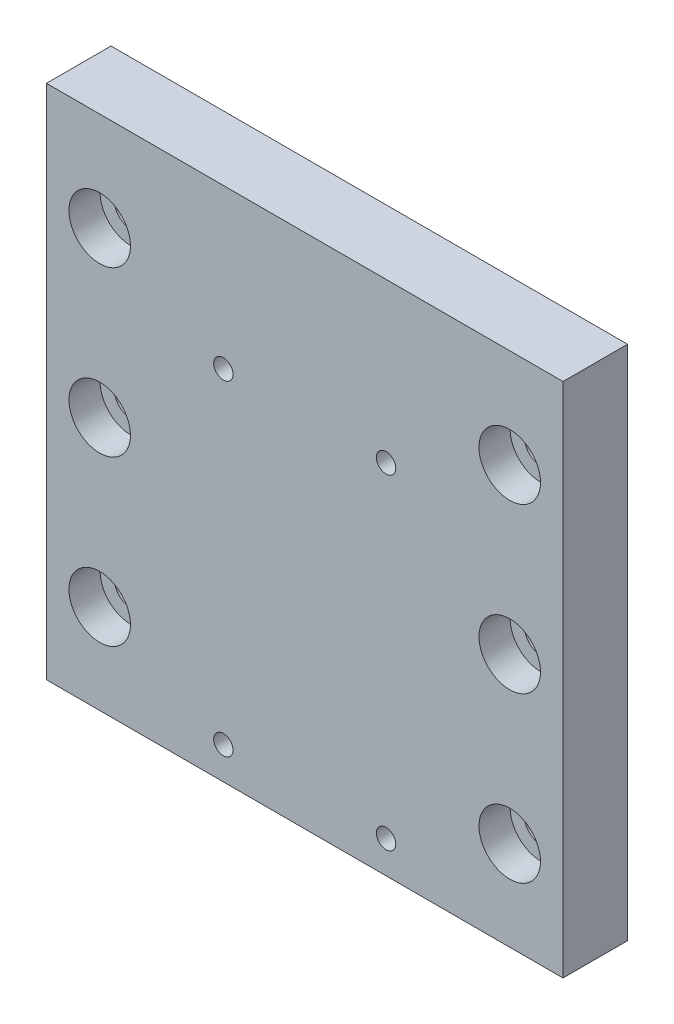
ISO-10303-21;
HEADER;
FILE_DESCRIPTION(('STEP AP214'),'2;1');
FILE_NAME('part.step','',(''),(''),'','','');
FILE_SCHEMA(('AUTOMOTIVE_DESIGN { 1 0 10303 214 1 1 1 1 }'));
ENDSEC;
DATA;
#1=APPLICATION_CONTEXT('core data for automotive mechanical design processes');
#2=APPLICATION_PROTOCOL_DEFINITION('international standard','automotive_design',2000,#1);
#3=PRODUCT_CONTEXT('',#1,'mechanical');
#4=PRODUCT('Part','Part','',(#3));
#5=PRODUCT_RELATED_PRODUCT_CATEGORY('part','',(#4));
#6=PRODUCT_DEFINITION_FORMATION('','',#4);
#7=PRODUCT_DEFINITION_CONTEXT('part definition',#1,'design');
#8=PRODUCT_DEFINITION('design','',#6,#7);
#9=PRODUCT_DEFINITION_SHAPE('','',#8);
#10=(LENGTH_UNIT() NAMED_UNIT(*) SI_UNIT(.MILLI.,.METRE.));
#11=(NAMED_UNIT(*) PLANE_ANGLE_UNIT() SI_UNIT($,.RADIAN.));
#12=(NAMED_UNIT(*) SI_UNIT($,.STERADIAN.) SOLID_ANGLE_UNIT());
#13=UNCERTAINTY_MEASURE_WITH_UNIT(LENGTH_MEASURE(1.E-05),#10,'distance_accuracy_value','');
#14=(GEOMETRIC_REPRESENTATION_CONTEXT(3) GLOBAL_UNCERTAINTY_ASSIGNED_CONTEXT((#13)) GLOBAL_UNIT_ASSIGNED_CONTEXT((#10,
#11,#12)) REPRESENTATION_CONTEXT('',''));
#15=CARTESIAN_POINT('',(0.,0.,0.));
#16=DIRECTION('',(0.,0.,1.));
#17=DIRECTION('',(1.,0.,0.));
#18=AXIS2_PLACEMENT_3D('',#15,#16,#17);
#19=CARTESIAN_POINT('',(-55.7364219114219,59.3850815850816,10.));
#20=DIRECTION('',(1.,0.,0.));
#21=DIRECTION('',(0.,1.,0.));
#22=AXIS2_PLACEMENT_3D('',#19,#20,#21);
#23=PLANE('',#22);
#24=DIRECTION('',(0.,-1.,0.));
#25=VECTOR('',#24,1.);
#26=CARTESIAN_POINT('',(-55.7364219114219,59.3850815850816,0.));
#27=LINE('',#26,#25);
#28=CARTESIAN_POINT('',(-55.7364219114219,59.3850815850816,0.));
#29=VERTEX_POINT('',#28);
#30=CARTESIAN_POINT('',(-55.7364219114219,-20.6149184149184,0.));
#31=VERTEX_POINT('',#30);
#32=EDGE_CURVE('E219',#29,#31,#27,.T.);
#33=ORIENTED_EDGE('',*,*,#32,.T.);
#34=DIRECTION('',(0.,0.,-1.));
#35=VECTOR('',#34,1.);
#36=CARTESIAN_POINT('',(-55.7364219114219,-20.6149184149184,10.));
#37=LINE('',#36,#35);
#38=CARTESIAN_POINT('',(-55.7364219114219,-20.6149184149184,10.));
#39=VERTEX_POINT('',#38);
#40=EDGE_CURVE('E11',#39,#31,#37,.T.);
#41=ORIENTED_EDGE('',*,*,#40,.F.);
#42=DIRECTION('',(0.,-1.,0.));
#43=VECTOR('',#42,1.);
#44=CARTESIAN_POINT('',(-55.7364219114219,59.3850815850816,10.));
#45=LINE('',#44,#43);
#46=CARTESIAN_POINT('',(-55.7364219114219,59.3850815850816,10.));
#47=VERTEX_POINT('',#46);
#48=EDGE_CURVE('E220',#47,#39,#45,.T.);
#49=ORIENTED_EDGE('',*,*,#48,.F.);
#50=DIRECTION('',(0.,0.,-1.));
#51=VECTOR('',#50,1.);
#52=CARTESIAN_POINT('',(-55.7364219114219,59.3850815850816,10.));
#53=LINE('',#52,#51);
#54=EDGE_CURVE('E226',#47,#29,#53,.T.);
#55=ORIENTED_EDGE('',*,*,#54,.T.);
#56=EDGE_LOOP('',(#33,#41,#49,#55));
#57=FACE_BOUND('',#56,.T.);
#58=ADVANCED_FACE('F31',(#57),#23,.F.);
#59=CARTESIAN_POINT('',(-55.7364219114219,-20.6149184149184,10.));
#60=DIRECTION('',(0.,1.,0.));
#61=DIRECTION('',(0.,0.,1.));
#62=AXIS2_PLACEMENT_3D('',#59,#60,#61);
#63=PLANE('',#62);
#64=DIRECTION('',(1.,0.,0.));
#65=VECTOR('',#64,1.);
#66=CARTESIAN_POINT('',(-55.7364219114219,-20.6149184149184,0.));
#67=LINE('',#66,#65);
#68=CARTESIAN_POINT('',(24.2635780885781,-20.6149184149184,0.));
#69=VERTEX_POINT('',#68);
#70=EDGE_CURVE('E229',#31,#69,#67,.T.);
#71=ORIENTED_EDGE('',*,*,#70,.T.);
#72=DIRECTION('',(0.,0.,-1.));
#73=VECTOR('',#72,1.);
#74=CARTESIAN_POINT('',(24.2635780885781,-20.6149184149184,10.));
#75=LINE('',#74,#73);
#76=CARTESIAN_POINT('',(24.2635780885781,-20.6149184149184,10.));
#77=VERTEX_POINT('',#76);
#78=EDGE_CURVE('E39',#77,#69,#75,.T.);
#79=ORIENTED_EDGE('',*,*,#78,.F.);
#80=DIRECTION('',(1.,0.,0.));
#81=VECTOR('',#80,1.);
#82=CARTESIAN_POINT('',(-55.7364219114219,-20.6149184149184,10.));
#83=LINE('',#82,#81);
#84=EDGE_CURVE('E78',#39,#77,#83,.T.);
#85=ORIENTED_EDGE('',*,*,#84,.F.);
#86=ORIENTED_EDGE('',*,*,#40,.T.);
#87=EDGE_LOOP('',(#71,#79,#85,#86));
#88=FACE_BOUND('',#87,.T.);
#89=ADVANCED_FACE('F253',(#88),#63,.F.);
#90=CARTESIAN_POINT('',(24.2635780885781,59.3850815850816,10.));
#91=DIRECTION('',(-1.,0.,0.));
#92=DIRECTION('',(0.,-1.,0.));
#93=AXIS2_PLACEMENT_3D('',#90,#91,#92);
#94=PLANE('',#93);
#95=DIRECTION('',(0.,1.,0.));
#96=VECTOR('',#95,1.);
#97=CARTESIAN_POINT('',(24.2635780885781,59.3850815850816,0.));
#98=LINE('',#97,#96);
#99=CARTESIAN_POINT('',(24.2635780885781,59.3850815850816,0.));
#100=VERTEX_POINT('',#99);
#101=EDGE_CURVE('E65',#69,#100,#98,.T.);
#102=ORIENTED_EDGE('',*,*,#101,.T.);
#103=DIRECTION('',(0.,0.,-1.));
#104=VECTOR('',#103,1.);
#105=CARTESIAN_POINT('',(24.2635780885781,59.3850815850816,10.));
#106=LINE('',#105,#104);
#107=CARTESIAN_POINT('',(24.2635780885781,59.3850815850816,10.));
#108=VERTEX_POINT('',#107);
#109=EDGE_CURVE('E234',#108,#100,#106,.T.);
#110=ORIENTED_EDGE('',*,*,#109,.F.);
#111=DIRECTION('',(0.,1.,0.));
#112=VECTOR('',#111,1.);
#113=CARTESIAN_POINT('',(24.2635780885781,59.3850815850816,10.));
#114=LINE('',#113,#112);
#115=EDGE_CURVE('E223',#77,#108,#114,.T.);
#116=ORIENTED_EDGE('',*,*,#115,.F.);
#117=ORIENTED_EDGE('',*,*,#78,.T.);
#118=EDGE_LOOP('',(#102,#110,#116,#117));
#119=FACE_BOUND('',#118,.T.);
#120=ADVANCED_FACE('F236',(#119),#94,.F.);
#121=CARTESIAN_POINT('',(-55.7364219114219,59.3850815850816,10.));
#122=DIRECTION('',(0.,-1.,0.));
#123=DIRECTION('',(0.,0.,-1.));
#124=AXIS2_PLACEMENT_3D('',#121,#122,#123);
#125=PLANE('',#124);
#126=DIRECTION('',(-1.,0.,0.));
#127=VECTOR('',#126,1.);
#128=CARTESIAN_POINT('',(-55.7364219114219,59.3850815850816,0.));
#129=LINE('',#128,#127);
#130=EDGE_CURVE('E71',#100,#29,#129,.T.);
#131=ORIENTED_EDGE('',*,*,#130,.T.);
#132=ORIENTED_EDGE('',*,*,#54,.F.);
#133=DIRECTION('',(-1.,0.,0.));
#134=VECTOR('',#133,1.);
#135=CARTESIAN_POINT('',(-55.7364219114219,59.3850815850816,10.));
#136=LINE('',#135,#134);
#137=EDGE_CURVE('E47',#108,#47,#136,.T.);
#138=ORIENTED_EDGE('',*,*,#137,.F.);
#139=ORIENTED_EDGE('',*,*,#109,.T.);
#140=EDGE_LOOP('',(#131,#132,#138,#139));
#141=FACE_BOUND('',#140,.T.);
#142=ADVANCED_FACE('F243',(#141),#125,.F.);
#143=CARTESIAN_POINT('',(-55.7364219114219,-20.6149184149184,10.));
#144=DIRECTION('',(0.,0.,1.));
#145=DIRECTION('',(1.,0.,0.));
#146=AXIS2_PLACEMENT_3D('',#143,#144,#145);
#147=PLANE('',#146);
#148=CARTESIAN_POINT('',(-3.13642191142191,34.7850815850816,10.));
#149=DIRECTION('',(0.,0.,1.));
#150=DIRECTION('',(1.,0.,0.));
#151=AXIS2_PLACEMENT_3D('',#148,#149,#150);
#152=CIRCLE('',#151,1.5);
#153=CARTESIAN_POINT('',(-1.63642191142191,34.7850815850816,10.));
#154=VERTEX_POINT('',#153);
#155=EDGE_CURVE('E108',#154,#154,#152,.T.);
#156=ORIENTED_EDGE('',*,*,#155,.F.);
#157=EDGE_LOOP('',(#156));
#158=FACE_BOUND('',#157,.T.);
#159=CARTESIAN_POINT('',(-3.13642191142191,-15.6149184149184,10.));
#160=DIRECTION('',(0.,0.,1.));
#161=DIRECTION('',(1.,0.,0.));
#162=AXIS2_PLACEMENT_3D('',#159,#160,#161);
#163=CIRCLE('',#162,1.5);
#164=CARTESIAN_POINT('',(-1.63642191142191,-15.6149184149184,10.));
#165=VERTEX_POINT('',#164);
#166=EDGE_CURVE('E120',#165,#165,#163,.T.);
#167=ORIENTED_EDGE('',*,*,#166,.F.);
#168=EDGE_LOOP('',(#167));
#169=FACE_BOUND('',#168,.T.);
#170=CARTESIAN_POINT('',(-28.3364219114219,34.7850815850816,10.));
#171=DIRECTION('',(0.,0.,1.));
#172=DIRECTION('',(1.,0.,0.));
#173=AXIS2_PLACEMENT_3D('',#170,#171,#172);
#174=CIRCLE('',#173,1.5);
#175=CARTESIAN_POINT('',(-26.8364219114219,34.7850815850816,10.));
#176=VERTEX_POINT('',#175);
#177=EDGE_CURVE('E132',#176,#176,#174,.T.);
#178=ORIENTED_EDGE('',*,*,#177,.F.);
#179=EDGE_LOOP('',(#178));
#180=FACE_BOUND('',#179,.T.);
#181=CARTESIAN_POINT('',(-28.3364219114219,-15.6149184149184,10.));
#182=DIRECTION('',(0.,0.,1.));
#183=DIRECTION('',(1.,0.,0.));
#184=AXIS2_PLACEMENT_3D('',#181,#182,#183);
#185=CIRCLE('',#184,1.5);
#186=CARTESIAN_POINT('',(-26.8364219114219,-15.6149184149184,10.));
#187=VERTEX_POINT('',#186);
#188=EDGE_CURVE('E144',#187,#187,#185,.T.);
#189=ORIENTED_EDGE('',*,*,#188,.F.);
#190=EDGE_LOOP('',(#189));
#191=FACE_BOUND('',#190,.T.);
#192=CARTESIAN_POINT('',(-47.4864219114219,44.0778554778555,10.));
#193=DIRECTION('',(0.,0.,1.));
#194=DIRECTION('',(1.,0.,0.));
#195=AXIS2_PLACEMENT_3D('',#192,#193,#194);
#196=CIRCLE('',#195,4.76249999999999);
#197=CARTESIAN_POINT('',(-42.7239219114219,44.0778554778555,10.));
#198=VERTEX_POINT('',#197);
#199=EDGE_CURVE('E156',#198,#198,#196,.T.);
#200=ORIENTED_EDGE('',*,*,#199,.F.);
#201=EDGE_LOOP('',(#200));
#202=FACE_BOUND('',#201,.T.);
#203=CARTESIAN_POINT('',(-47.4864219114219,18.6778554778555,10.));
#204=DIRECTION('',(0.,0.,1.));
#205=DIRECTION('',(1.,0.,0.));
#206=AXIS2_PLACEMENT_3D('',#203,#204,#205);
#207=CIRCLE('',#206,4.76249999999999);
#208=CARTESIAN_POINT('',(-42.7239219114219,18.6778554778555,10.));
#209=VERTEX_POINT('',#208);
#210=EDGE_CURVE('E168',#209,#209,#207,.T.);
#211=ORIENTED_EDGE('',*,*,#210,.F.);
#212=EDGE_LOOP('',(#211));
#213=FACE_BOUND('',#212,.T.);
#214=CARTESIAN_POINT('',(-47.4864219114219,-6.7221445221445,10.));
#215=DIRECTION('',(0.,0.,1.));
#216=DIRECTION('',(1.,0.,0.));
#217=AXIS2_PLACEMENT_3D('',#214,#215,#216);
#218=CIRCLE('',#217,4.76249999999999);
#219=CARTESIAN_POINT('',(-42.7239219114219,-6.7221445221445,10.));
#220=VERTEX_POINT('',#219);
#221=EDGE_CURVE('E180',#220,#220,#218,.T.);
#222=ORIENTED_EDGE('',*,*,#221,.F.);
#223=EDGE_LOOP('',(#222));
#224=FACE_BOUND('',#223,.T.);
#225=CARTESIAN_POINT('',(16.0135780885781,-6.7221445221445,10.));
#226=DIRECTION('',(0.,0.,1.));
#227=DIRECTION('',(1.,0.,0.));
#228=AXIS2_PLACEMENT_3D('',#225,#226,#227);
#229=CIRCLE('',#228,4.76249999999999);
#230=CARTESIAN_POINT('',(20.7760780885781,-6.7221445221445,10.));
#231=VERTEX_POINT('',#230);
#232=EDGE_CURVE('E192',#231,#231,#229,.T.);
#233=ORIENTED_EDGE('',*,*,#232,.F.);
#234=EDGE_LOOP('',(#233));
#235=FACE_BOUND('',#234,.T.);
#236=CARTESIAN_POINT('',(16.0135780885781,18.6778554778555,10.));
#237=DIRECTION('',(0.,0.,1.));
#238=DIRECTION('',(1.,0.,0.));
#239=AXIS2_PLACEMENT_3D('',#236,#237,#238);
#240=CIRCLE('',#239,4.76249999999999);
#241=CARTESIAN_POINT('',(20.7760780885781,18.6778554778555,10.));
#242=VERTEX_POINT('',#241);
#243=EDGE_CURVE('E204',#242,#242,#240,.T.);
#244=ORIENTED_EDGE('',*,*,#243,.F.);
#245=EDGE_LOOP('',(#244));
#246=FACE_BOUND('',#245,.T.);
#247=CARTESIAN_POINT('',(16.0135780885781,44.0778554778555,10.));
#248=DIRECTION('',(0.,0.,1.));
#249=DIRECTION('',(1.,0.,0.));
#250=AXIS2_PLACEMENT_3D('',#247,#248,#249);
#251=CIRCLE('',#250,4.76249999999999);
#252=CARTESIAN_POINT('',(20.7760780885781,44.0778554778555,10.));
#253=VERTEX_POINT('',#252);
#254=EDGE_CURVE('E216',#253,#253,#251,.T.);
#255=ORIENTED_EDGE('',*,*,#254,.F.);
#256=EDGE_LOOP('',(#255));
#257=FACE_BOUND('',#256,.T.);
#258=ORIENTED_EDGE('',*,*,#48,.T.);
#259=ORIENTED_EDGE('',*,*,#84,.T.);
#260=ORIENTED_EDGE('',*,*,#115,.T.);
#261=ORIENTED_EDGE('',*,*,#137,.T.);
#262=EDGE_LOOP('',(#258,#259,#260,#261));
#263=FACE_BOUND('',#262,.T.);
#264=ADVANCED_FACE('F245',(#158,#169,#180,#191,#202,#213,#224,#235,#246,#257,#263),#147,.T.);
#265=CARTESIAN_POINT('',(-55.7364219114219,-20.6149184149184,0.));
#266=DIRECTION('',(0.,0.,1.));
#267=DIRECTION('',(1.,0.,0.));
#268=AXIS2_PLACEMENT_3D('',#265,#266,#267);
#269=PLANE('',#268);
#270=CARTESIAN_POINT('',(-47.4864219114219,44.0778554778555,0.));
#271=DIRECTION('',(0.,0.,1.));
#272=DIRECTION('',(1.,0.,0.));
#273=AXIS2_PLACEMENT_3D('',#270,#271,#272);
#274=CIRCLE('',#273,2.5527);
#275=CARTESIAN_POINT('',(-44.9337219114219,44.0778554778555,0.));
#276=VERTEX_POINT('',#275);
#277=EDGE_CURVE('E147',#276,#276,#274,.T.);
#278=ORIENTED_EDGE('',*,*,#277,.T.);
#279=EDGE_LOOP('',(#278));
#280=FACE_BOUND('',#279,.T.);
#281=CARTESIAN_POINT('',(-47.4864219114219,18.6778554778555,0.));
#282=DIRECTION('',(0.,0.,1.));
#283=DIRECTION('',(1.,0.,0.));
#284=AXIS2_PLACEMENT_3D('',#281,#282,#283);
#285=CIRCLE('',#284,2.5527);
#286=CARTESIAN_POINT('',(-44.9337219114219,18.6778554778555,0.));
#287=VERTEX_POINT('',#286);
#288=EDGE_CURVE('E159',#287,#287,#285,.T.);
#289=ORIENTED_EDGE('',*,*,#288,.T.);
#290=EDGE_LOOP('',(#289));
#291=FACE_BOUND('',#290,.T.);
#292=CARTESIAN_POINT('',(-47.4864219114219,-6.7221445221445,0.));
#293=DIRECTION('',(0.,0.,1.));
#294=DIRECTION('',(1.,0.,0.));
#295=AXIS2_PLACEMENT_3D('',#292,#293,#294);
#296=CIRCLE('',#295,2.5527);
#297=CARTESIAN_POINT('',(-44.9337219114219,-6.7221445221445,0.));
#298=VERTEX_POINT('',#297);
#299=EDGE_CURVE('E171',#298,#298,#296,.T.);
#300=ORIENTED_EDGE('',*,*,#299,.T.);
#301=EDGE_LOOP('',(#300));
#302=FACE_BOUND('',#301,.T.);
#303=CARTESIAN_POINT('',(16.0135780885781,-6.7221445221445,0.));
#304=DIRECTION('',(0.,0.,1.));
#305=DIRECTION('',(1.,0.,0.));
#306=AXIS2_PLACEMENT_3D('',#303,#304,#305);
#307=CIRCLE('',#306,2.5527);
#308=CARTESIAN_POINT('',(18.5662780885781,-6.7221445221445,0.));
#309=VERTEX_POINT('',#308);
#310=EDGE_CURVE('E183',#309,#309,#307,.T.);
#311=ORIENTED_EDGE('',*,*,#310,.T.);
#312=EDGE_LOOP('',(#311));
#313=FACE_BOUND('',#312,.T.);
#314=CARTESIAN_POINT('',(16.0135780885781,18.6778554778555,0.));
#315=DIRECTION('',(0.,0.,1.));
#316=DIRECTION('',(1.,0.,0.));
#317=AXIS2_PLACEMENT_3D('',#314,#315,#316);
#318=CIRCLE('',#317,2.5527);
#319=CARTESIAN_POINT('',(18.5662780885781,18.6778554778555,0.));
#320=VERTEX_POINT('',#319);
#321=EDGE_CURVE('E195',#320,#320,#318,.T.);
#322=ORIENTED_EDGE('',*,*,#321,.T.);
#323=EDGE_LOOP('',(#322));
#324=FACE_BOUND('',#323,.T.);
#325=CARTESIAN_POINT('',(16.0135780885781,44.0778554778555,0.));
#326=DIRECTION('',(0.,0.,1.));
#327=DIRECTION('',(1.,0.,0.));
#328=AXIS2_PLACEMENT_3D('',#325,#326,#327);
#329=CIRCLE('',#328,2.5527);
#330=CARTESIAN_POINT('',(18.5662780885781,44.0778554778555,0.));
#331=VERTEX_POINT('',#330);
#332=EDGE_CURVE('E207',#331,#331,#329,.T.);
#333=ORIENTED_EDGE('',*,*,#332,.T.);
#334=EDGE_LOOP('',(#333));
#335=FACE_BOUND('',#334,.T.);
#336=ORIENTED_EDGE('',*,*,#32,.F.);
#337=ORIENTED_EDGE('',*,*,#130,.F.);
#338=ORIENTED_EDGE('',*,*,#101,.F.);
#339=ORIENTED_EDGE('',*,*,#70,.F.);
#340=EDGE_LOOP('',(#336,#337,#338,#339));
#341=FACE_BOUND('',#340,.T.);
#342=ADVANCED_FACE('F239',(#280,#291,#302,#313,#324,#335,#341),#269,.F.);
#343=CARTESIAN_POINT('',(16.0135780885781,44.0778554778555,10.));
#344=DIRECTION('',(0.,0.,1.));
#345=DIRECTION('',(1.,0.,0.));
#346=AXIS2_PLACEMENT_3D('',#343,#344,#345);
#347=CYLINDRICAL_SURFACE('',#346,4.76249999999999);
#348=CARTESIAN_POINT('',(16.0135780885781,44.0778554778555,5.174));
#349=DIRECTION('',(0.,0.,1.));
#350=DIRECTION('',(1.,0.,0.));
#351=AXIS2_PLACEMENT_3D('',#348,#349,#350);
#352=CIRCLE('',#351,4.76249999999999);
#353=CARTESIAN_POINT('',(20.7760780885781,44.0778554778555,5.174));
#354=VERTEX_POINT('',#353);
#355=EDGE_CURVE('E213',#354,#354,#352,.T.);
#356=ORIENTED_EDGE('',*,*,#355,.F.);
#357=EDGE_LOOP('',(#356));
#358=FACE_BOUND('',#357,.T.);
#359=ORIENTED_EDGE('',*,*,#254,.T.);
#360=EDGE_LOOP('',(#359));
#361=FACE_BOUND('',#360,.T.);
#362=ADVANCED_FACE('F280',(#358,#361),#347,.F.);
#363=CARTESIAN_POINT('',(18.5662780885781,44.0778554778555,5.174));
#364=DIRECTION('',(0.,0.,-1.));
#365=DIRECTION('',(-1.,0.,0.));
#366=AXIS2_PLACEMENT_3D('',#363,#364,#365);
#367=PLANE('',#366);
#368=CARTESIAN_POINT('',(16.0135780885781,44.0778554778555,5.174));
#369=DIRECTION('',(0.,0.,1.));
#370=DIRECTION('',(1.,0.,0.));
#371=AXIS2_PLACEMENT_3D('',#368,#369,#370);
#372=CIRCLE('',#371,2.55270000000001);
#373=CARTESIAN_POINT('',(18.5662780885781,44.0778554778555,5.174));
#374=VERTEX_POINT('',#373);
#375=EDGE_CURVE('E210',#374,#374,#372,.T.);
#376=ORIENTED_EDGE('',*,*,#375,.F.);
#377=EDGE_LOOP('',(#376));
#378=FACE_BOUND('',#377,.T.);
#379=ORIENTED_EDGE('',*,*,#355,.T.);
#380=EDGE_LOOP('',(#379));
#381=FACE_BOUND('',#380,.T.);
#382=ADVANCED_FACE('F289',(#378,#381),#367,.F.);
#383=CARTESIAN_POINT('',(16.0135780885781,44.0778554778555,10.));
#384=DIRECTION('',(0.,0.,1.));
#385=DIRECTION('',(1.,0.,0.));
#386=AXIS2_PLACEMENT_3D('',#383,#384,#385);
#387=CYLINDRICAL_SURFACE('',#386,2.55270000000001);
#388=ORIENTED_EDGE('',*,*,#332,.F.);
#389=EDGE_LOOP('',(#388));
#390=FACE_BOUND('',#389,.T.);
#391=ORIENTED_EDGE('',*,*,#375,.T.);
#392=EDGE_LOOP('',(#391));
#393=FACE_BOUND('',#392,.T.);
#394=ADVANCED_FACE('F299',(#390,#393),#387,.F.);
#395=CARTESIAN_POINT('',(16.0135780885781,18.6778554778555,10.));
#396=DIRECTION('',(0.,0.,1.));
#397=DIRECTION('',(1.,0.,0.));
#398=AXIS2_PLACEMENT_3D('',#395,#396,#397);
#399=CYLINDRICAL_SURFACE('',#398,4.76249999999999);
#400=CARTESIAN_POINT('',(16.0135780885781,18.6778554778555,5.174));
#401=DIRECTION('',(0.,0.,1.));
#402=DIRECTION('',(1.,0.,0.));
#403=AXIS2_PLACEMENT_3D('',#400,#401,#402);
#404=CIRCLE('',#403,4.76249999999999);
#405=CARTESIAN_POINT('',(20.7760780885781,18.6778554778555,5.174));
#406=VERTEX_POINT('',#405);
#407=EDGE_CURVE('E201',#406,#406,#404,.T.);
#408=ORIENTED_EDGE('',*,*,#407,.F.);
#409=EDGE_LOOP('',(#408));
#410=FACE_BOUND('',#409,.T.);
#411=ORIENTED_EDGE('',*,*,#243,.T.);
#412=EDGE_LOOP('',(#411));
#413=FACE_BOUND('',#412,.T.);
#414=ADVANCED_FACE('F309',(#410,#413),#399,.F.);
#415=CARTESIAN_POINT('',(18.5662780885781,18.6778554778555,5.174));
#416=DIRECTION('',(0.,0.,-1.));
#417=DIRECTION('',(-1.,0.,0.));
#418=AXIS2_PLACEMENT_3D('',#415,#416,#417);
#419=PLANE('',#418);
#420=CARTESIAN_POINT('',(16.0135780885781,18.6778554778555,5.174));
#421=DIRECTION('',(0.,0.,1.));
#422=DIRECTION('',(1.,0.,0.));
#423=AXIS2_PLACEMENT_3D('',#420,#421,#422);
#424=CIRCLE('',#423,2.55270000000001);
#425=CARTESIAN_POINT('',(18.5662780885781,18.6778554778555,5.174));
#426=VERTEX_POINT('',#425);
#427=EDGE_CURVE('E198',#426,#426,#424,.T.);
#428=ORIENTED_EDGE('',*,*,#427,.F.);
#429=EDGE_LOOP('',(#428));
#430=FACE_BOUND('',#429,.T.);
#431=ORIENTED_EDGE('',*,*,#407,.T.);
#432=EDGE_LOOP('',(#431));
#433=FACE_BOUND('',#432,.T.);
#434=ADVANCED_FACE('F319',(#430,#433),#419,.F.);
#435=CARTESIAN_POINT('',(16.0135780885781,18.6778554778555,10.));
#436=DIRECTION('',(0.,0.,1.));
#437=DIRECTION('',(1.,0.,0.));
#438=AXIS2_PLACEMENT_3D('',#435,#436,#437);
#439=CYLINDRICAL_SURFACE('',#438,2.55270000000001);
#440=ORIENTED_EDGE('',*,*,#321,.F.);
#441=EDGE_LOOP('',(#440));
#442=FACE_BOUND('',#441,.T.);
#443=ORIENTED_EDGE('',*,*,#427,.T.);
#444=EDGE_LOOP('',(#443));
#445=FACE_BOUND('',#444,.T.);
#446=ADVANCED_FACE('F329',(#442,#445),#439,.F.);
#447=CARTESIAN_POINT('',(16.0135780885781,-6.7221445221445,10.));
#448=DIRECTION('',(0.,0.,1.));
#449=DIRECTION('',(1.,0.,0.));
#450=AXIS2_PLACEMENT_3D('',#447,#448,#449);
#451=CYLINDRICAL_SURFACE('',#450,4.76249999999999);
#452=CARTESIAN_POINT('',(16.0135780885781,-6.7221445221445,5.174));
#453=DIRECTION('',(0.,0.,1.));
#454=DIRECTION('',(1.,0.,0.));
#455=AXIS2_PLACEMENT_3D('',#452,#453,#454);
#456=CIRCLE('',#455,4.76249999999999);
#457=CARTESIAN_POINT('',(20.7760780885781,-6.7221445221445,5.174));
#458=VERTEX_POINT('',#457);
#459=EDGE_CURVE('E189',#458,#458,#456,.T.);
#460=ORIENTED_EDGE('',*,*,#459,.F.);
#461=EDGE_LOOP('',(#460));
#462=FACE_BOUND('',#461,.T.);
#463=ORIENTED_EDGE('',*,*,#232,.T.);
#464=EDGE_LOOP('',(#463));
#465=FACE_BOUND('',#464,.T.);
#466=ADVANCED_FACE('F339',(#462,#465),#451,.F.);
#467=CARTESIAN_POINT('',(18.5662780885781,-6.7221445221445,5.174));
#468=DIRECTION('',(0.,0.,-1.));
#469=DIRECTION('',(-1.,0.,0.));
#470=AXIS2_PLACEMENT_3D('',#467,#468,#469);
#471=PLANE('',#470);
#472=CARTESIAN_POINT('',(16.0135780885781,-6.7221445221445,5.174));
#473=DIRECTION('',(0.,0.,1.));
#474=DIRECTION('',(1.,0.,0.));
#475=AXIS2_PLACEMENT_3D('',#472,#473,#474);
#476=CIRCLE('',#475,2.55270000000001);
#477=CARTESIAN_POINT('',(18.5662780885781,-6.7221445221445,5.174));
#478=VERTEX_POINT('',#477);
#479=EDGE_CURVE('E186',#478,#478,#476,.T.);
#480=ORIENTED_EDGE('',*,*,#479,.F.);
#481=EDGE_LOOP('',(#480));
#482=FACE_BOUND('',#481,.T.);
#483=ORIENTED_EDGE('',*,*,#459,.T.);
#484=EDGE_LOOP('',(#483));
#485=FACE_BOUND('',#484,.T.);
#486=ADVANCED_FACE('F349',(#482,#485),#471,.F.);
#487=CARTESIAN_POINT('',(16.0135780885781,-6.7221445221445,10.));
#488=DIRECTION('',(0.,0.,1.));
#489=DIRECTION('',(1.,0.,0.));
#490=AXIS2_PLACEMENT_3D('',#487,#488,#489);
#491=CYLINDRICAL_SURFACE('',#490,2.55270000000001);
#492=ORIENTED_EDGE('',*,*,#310,.F.);
#493=EDGE_LOOP('',(#492));
#494=FACE_BOUND('',#493,.T.);
#495=ORIENTED_EDGE('',*,*,#479,.T.);
#496=EDGE_LOOP('',(#495));
#497=FACE_BOUND('',#496,.T.);
#498=ADVANCED_FACE('F359',(#494,#497),#491,.F.);
#499=CARTESIAN_POINT('',(-47.4864219114219,-6.7221445221445,10.));
#500=DIRECTION('',(0.,0.,1.));
#501=DIRECTION('',(1.,0.,0.));
#502=AXIS2_PLACEMENT_3D('',#499,#500,#501);
#503=CYLINDRICAL_SURFACE('',#502,4.76249999999999);
#504=CARTESIAN_POINT('',(-47.4864219114219,-6.7221445221445,5.174));
#505=DIRECTION('',(0.,0.,1.));
#506=DIRECTION('',(1.,0.,0.));
#507=AXIS2_PLACEMENT_3D('',#504,#505,#506);
#508=CIRCLE('',#507,4.76249999999999);
#509=CARTESIAN_POINT('',(-42.7239219114219,-6.7221445221445,5.174));
#510=VERTEX_POINT('',#509);
#511=EDGE_CURVE('E177',#510,#510,#508,.T.);
#512=ORIENTED_EDGE('',*,*,#511,.F.);
#513=EDGE_LOOP('',(#512));
#514=FACE_BOUND('',#513,.T.);
#515=ORIENTED_EDGE('',*,*,#221,.T.);
#516=EDGE_LOOP('',(#515));
#517=FACE_BOUND('',#516,.T.);
#518=ADVANCED_FACE('F369',(#514,#517),#503,.F.);
#519=CARTESIAN_POINT('',(-44.9337219114219,-6.7221445221445,5.174));
#520=DIRECTION('',(0.,0.,-1.));
#521=DIRECTION('',(-1.,0.,0.));
#522=AXIS2_PLACEMENT_3D('',#519,#520,#521);
#523=PLANE('',#522);
#524=CARTESIAN_POINT('',(-47.4864219114219,-6.7221445221445,5.174));
#525=DIRECTION('',(0.,0.,1.));
#526=DIRECTION('',(1.,0.,0.));
#527=AXIS2_PLACEMENT_3D('',#524,#525,#526);
#528=CIRCLE('',#527,2.55270000000001);
#529=CARTESIAN_POINT('',(-44.9337219114219,-6.7221445221445,5.174));
#530=VERTEX_POINT('',#529);
#531=EDGE_CURVE('E174',#530,#530,#528,.T.);
#532=ORIENTED_EDGE('',*,*,#531,.F.);
#533=EDGE_LOOP('',(#532));
#534=FACE_BOUND('',#533,.T.);
#535=ORIENTED_EDGE('',*,*,#511,.T.);
#536=EDGE_LOOP('',(#535));
#537=FACE_BOUND('',#536,.T.);
#538=ADVANCED_FACE('F379',(#534,#537),#523,.F.);
#539=CARTESIAN_POINT('',(-47.4864219114219,-6.7221445221445,10.));
#540=DIRECTION('',(0.,0.,1.));
#541=DIRECTION('',(1.,0.,0.));
#542=AXIS2_PLACEMENT_3D('',#539,#540,#541);
#543=CYLINDRICAL_SURFACE('',#542,2.55270000000001);
#544=ORIENTED_EDGE('',*,*,#299,.F.);
#545=EDGE_LOOP('',(#544));
#546=FACE_BOUND('',#545,.T.);
#547=ORIENTED_EDGE('',*,*,#531,.T.);
#548=EDGE_LOOP('',(#547));
#549=FACE_BOUND('',#548,.T.);
#550=ADVANCED_FACE('F389',(#546,#549),#543,.F.);
#551=CARTESIAN_POINT('',(-47.4864219114219,18.6778554778555,10.));
#552=DIRECTION('',(0.,0.,1.));
#553=DIRECTION('',(1.,0.,0.));
#554=AXIS2_PLACEMENT_3D('',#551,#552,#553);
#555=CYLINDRICAL_SURFACE('',#554,4.76249999999999);
#556=CARTESIAN_POINT('',(-47.4864219114219,18.6778554778555,5.174));
#557=DIRECTION('',(0.,0.,1.));
#558=DIRECTION('',(1.,0.,0.));
#559=AXIS2_PLACEMENT_3D('',#556,#557,#558);
#560=CIRCLE('',#559,4.76249999999999);
#561=CARTESIAN_POINT('',(-42.7239219114219,18.6778554778555,5.174));
#562=VERTEX_POINT('',#561);
#563=EDGE_CURVE('E165',#562,#562,#560,.T.);
#564=ORIENTED_EDGE('',*,*,#563,.F.);
#565=EDGE_LOOP('',(#564));
#566=FACE_BOUND('',#565,.T.);
#567=ORIENTED_EDGE('',*,*,#210,.T.);
#568=EDGE_LOOP('',(#567));
#569=FACE_BOUND('',#568,.T.);
#570=ADVANCED_FACE('F399',(#566,#569),#555,.F.);
#571=CARTESIAN_POINT('',(-44.9337219114219,18.6778554778555,5.174));
#572=DIRECTION('',(0.,0.,-1.));
#573=DIRECTION('',(-1.,0.,0.));
#574=AXIS2_PLACEMENT_3D('',#571,#572,#573);
#575=PLANE('',#574);
#576=CARTESIAN_POINT('',(-47.4864219114219,18.6778554778555,5.174));
#577=DIRECTION('',(0.,0.,1.));
#578=DIRECTION('',(1.,0.,0.));
#579=AXIS2_PLACEMENT_3D('',#576,#577,#578);
#580=CIRCLE('',#579,2.55270000000001);
#581=CARTESIAN_POINT('',(-44.9337219114219,18.6778554778555,5.174));
#582=VERTEX_POINT('',#581);
#583=EDGE_CURVE('E162',#582,#582,#580,.T.);
#584=ORIENTED_EDGE('',*,*,#583,.F.);
#585=EDGE_LOOP('',(#584));
#586=FACE_BOUND('',#585,.T.);
#587=ORIENTED_EDGE('',*,*,#563,.T.);
#588=EDGE_LOOP('',(#587));
#589=FACE_BOUND('',#588,.T.);
#590=ADVANCED_FACE('F409',(#586,#589),#575,.F.);
#591=CARTESIAN_POINT('',(-47.4864219114219,18.6778554778555,10.));
#592=DIRECTION('',(0.,0.,1.));
#593=DIRECTION('',(1.,0.,0.));
#594=AXIS2_PLACEMENT_3D('',#591,#592,#593);
#595=CYLINDRICAL_SURFACE('',#594,2.55270000000001);
#596=ORIENTED_EDGE('',*,*,#288,.F.);
#597=EDGE_LOOP('',(#596));
#598=FACE_BOUND('',#597,.T.);
#599=ORIENTED_EDGE('',*,*,#583,.T.);
#600=EDGE_LOOP('',(#599));
#601=FACE_BOUND('',#600,.T.);
#602=ADVANCED_FACE('F419',(#598,#601),#595,.F.);
#603=CARTESIAN_POINT('',(-47.4864219114219,44.0778554778555,10.));
#604=DIRECTION('',(0.,0.,1.));
#605=DIRECTION('',(1.,0.,0.));
#606=AXIS2_PLACEMENT_3D('',#603,#604,#605);
#607=CYLINDRICAL_SURFACE('',#606,4.76249999999999);
#608=CARTESIAN_POINT('',(-47.4864219114219,44.0778554778555,5.174));
#609=DIRECTION('',(0.,0.,1.));
#610=DIRECTION('',(1.,0.,0.));
#611=AXIS2_PLACEMENT_3D('',#608,#609,#610);
#612=CIRCLE('',#611,4.76249999999999);
#613=CARTESIAN_POINT('',(-42.7239219114219,44.0778554778555,5.174));
#614=VERTEX_POINT('',#613);
#615=EDGE_CURVE('E153',#614,#614,#612,.T.);
#616=ORIENTED_EDGE('',*,*,#615,.F.);
#617=EDGE_LOOP('',(#616));
#618=FACE_BOUND('',#617,.T.);
#619=ORIENTED_EDGE('',*,*,#199,.T.);
#620=EDGE_LOOP('',(#619));
#621=FACE_BOUND('',#620,.T.);
#622=ADVANCED_FACE('F429',(#618,#621),#607,.F.);
#623=CARTESIAN_POINT('',(-44.9337219114219,44.0778554778555,5.174));
#624=DIRECTION('',(0.,0.,-1.));
#625=DIRECTION('',(-1.,0.,0.));
#626=AXIS2_PLACEMENT_3D('',#623,#624,#625);
#627=PLANE('',#626);
#628=CARTESIAN_POINT('',(-47.4864219114219,44.0778554778555,5.174));
#629=DIRECTION('',(0.,0.,1.));
#630=DIRECTION('',(1.,0.,0.));
#631=AXIS2_PLACEMENT_3D('',#628,#629,#630);
#632=CIRCLE('',#631,2.55270000000001);
#633=CARTESIAN_POINT('',(-44.9337219114219,44.0778554778555,5.174));
#634=VERTEX_POINT('',#633);
#635=EDGE_CURVE('E150',#634,#634,#632,.T.);
#636=ORIENTED_EDGE('',*,*,#635,.F.);
#637=EDGE_LOOP('',(#636));
#638=FACE_BOUND('',#637,.T.);
#639=ORIENTED_EDGE('',*,*,#615,.T.);
#640=EDGE_LOOP('',(#639));
#641=FACE_BOUND('',#640,.T.);
#642=ADVANCED_FACE('F439',(#638,#641),#627,.F.);
#643=CARTESIAN_POINT('',(-47.4864219114219,44.0778554778555,10.));
#644=DIRECTION('',(0.,0.,1.));
#645=DIRECTION('',(1.,0.,0.));
#646=AXIS2_PLACEMENT_3D('',#643,#644,#645);
#647=CYLINDRICAL_SURFACE('',#646,2.55270000000001);
#648=ORIENTED_EDGE('',*,*,#277,.F.);
#649=EDGE_LOOP('',(#648));
#650=FACE_BOUND('',#649,.T.);
#651=ORIENTED_EDGE('',*,*,#635,.T.);
#652=EDGE_LOOP('',(#651));
#653=FACE_BOUND('',#652,.T.);
#654=ADVANCED_FACE('F449',(#650,#653),#647,.F.);
#655=CARTESIAN_POINT('',(-28.3364219114219,-15.6149184149184,10.));
#656=DIRECTION('',(0.,0.,1.));
#657=DIRECTION('',(1.,0.,0.));
#658=AXIS2_PLACEMENT_3D('',#655,#656,#657);
#659=CYLINDRICAL_SURFACE('',#658,1.5);
#660=CARTESIAN_POINT('',(-28.3364219114219,-15.6149184149184,4.));
#661=DIRECTION('',(0.,0.,1.));
#662=DIRECTION('',(1.,0.,0.));
#663=AXIS2_PLACEMENT_3D('',#660,#661,#662);
#664=CIRCLE('',#663,1.5);
#665=CARTESIAN_POINT('',(-26.8364219114219,-15.6149184149184,4.));
#666=VERTEX_POINT('',#665);
#667=EDGE_CURVE('E141',#666,#666,#664,.T.);
#668=ORIENTED_EDGE('',*,*,#667,.F.);
#669=EDGE_LOOP('',(#668));
#670=FACE_BOUND('',#669,.T.);
#671=ORIENTED_EDGE('',*,*,#188,.T.);
#672=EDGE_LOOP('',(#671));
#673=FACE_BOUND('',#672,.T.);
#674=ADVANCED_FACE('F459',(#670,#673),#659,.F.);
#675=CARTESIAN_POINT('',(-27.0864219114219,-15.6149184149184,4.));
#676=DIRECTION('',(0.,0.,-1.));
#677=DIRECTION('',(-1.,0.,0.));
#678=AXIS2_PLACEMENT_3D('',#675,#676,#677);
#679=PLANE('',#678);
#680=CARTESIAN_POINT('',(-28.3364219114219,-15.6149184149184,4.));
#681=DIRECTION('',(0.,0.,1.));
#682=DIRECTION('',(1.,0.,0.));
#683=AXIS2_PLACEMENT_3D('',#680,#681,#682);
#684=CIRCLE('',#683,1.25);
#685=CARTESIAN_POINT('',(-27.0864219114219,-15.6149184149184,4.));
#686=VERTEX_POINT('',#685);
#687=EDGE_CURVE('E138',#686,#686,#684,.T.);
#688=ORIENTED_EDGE('',*,*,#687,.F.);
#689=EDGE_LOOP('',(#688));
#690=FACE_BOUND('',#689,.T.);
#691=ORIENTED_EDGE('',*,*,#667,.T.);
#692=EDGE_LOOP('',(#691));
#693=FACE_BOUND('',#692,.T.);
#694=ADVANCED_FACE('F469',(#690,#693),#679,.F.);
#695=CARTESIAN_POINT('',(-28.3364219114219,-15.6149184149184,10.));
#696=DIRECTION('',(0.,0.,1.));
#697=DIRECTION('',(1.,0.,0.));
#698=AXIS2_PLACEMENT_3D('',#695,#696,#697);
#699=CYLINDRICAL_SURFACE('',#698,1.25);
#700=CARTESIAN_POINT('',(-28.3364219114219,-15.6149184149184,2.5));
#701=DIRECTION('',(0.,0.,1.));
#702=DIRECTION('',(1.,0.,0.));
#703=AXIS2_PLACEMENT_3D('',#700,#701,#702);
#704=CIRCLE('',#703,1.25);
#705=CARTESIAN_POINT('',(-27.0864219114219,-15.6149184149184,2.5));
#706=VERTEX_POINT('',#705);
#707=EDGE_CURVE('E135',#706,#706,#704,.T.);
#708=ORIENTED_EDGE('',*,*,#707,.F.);
#709=EDGE_LOOP('',(#708));
#710=FACE_BOUND('',#709,.T.);
#711=ORIENTED_EDGE('',*,*,#687,.T.);
#712=EDGE_LOOP('',(#711));
#713=FACE_BOUND('',#712,.T.);
#714=ADVANCED_FACE('F479',(#710,#713),#699,.F.);
#715=CARTESIAN_POINT('',(-28.3364219114219,-15.6149184149184,2.5));
#716=DIRECTION('',(0.,0.,1.));
#717=DIRECTION('',(1.,0.,0.));
#718=AXIS2_PLACEMENT_3D('',#715,#716,#717);
#719=CONICAL_SURFACE('',#718,1.25,1.02974425867665);
#720=CARTESIAN_POINT('',(-28.3364219114219,-15.6149184149184,1.74892422621555));
#721=VERTEX_POINT('',#720);
#722=VERTEX_LOOP('',#721);
#723=FACE_BOUND('',#722,.T.);
#724=ORIENTED_EDGE('',*,*,#707,.T.);
#725=EDGE_LOOP('',(#724));
#726=FACE_BOUND('',#725,.T.);
#727=ADVANCED_FACE('F489',(#723,#726),#719,.F.);
#728=CARTESIAN_POINT('',(-28.3364219114219,34.7850815850816,10.));
#729=DIRECTION('',(0.,0.,1.));
#730=DIRECTION('',(1.,0.,0.));
#731=AXIS2_PLACEMENT_3D('',#728,#729,#730);
#732=CYLINDRICAL_SURFACE('',#731,1.5);
#733=CARTESIAN_POINT('',(-28.3364219114219,34.7850815850816,4.));
#734=DIRECTION('',(0.,0.,1.));
#735=DIRECTION('',(1.,0.,0.));
#736=AXIS2_PLACEMENT_3D('',#733,#734,#735);
#737=CIRCLE('',#736,1.5);
#738=CARTESIAN_POINT('',(-26.8364219114219,34.7850815850816,4.));
#739=VERTEX_POINT('',#738);
#740=EDGE_CURVE('E129',#739,#739,#737,.T.);
#741=ORIENTED_EDGE('',*,*,#740,.F.);
#742=EDGE_LOOP('',(#741));
#743=FACE_BOUND('',#742,.T.);
#744=ORIENTED_EDGE('',*,*,#177,.T.);
#745=EDGE_LOOP('',(#744));
#746=FACE_BOUND('',#745,.T.);
#747=ADVANCED_FACE('F499',(#743,#746),#732,.F.);
#748=CARTESIAN_POINT('',(-27.0864219114219,34.7850815850816,4.));
#749=DIRECTION('',(0.,0.,-1.));
#750=DIRECTION('',(-1.,0.,0.));
#751=AXIS2_PLACEMENT_3D('',#748,#749,#750);
#752=PLANE('',#751);
#753=CARTESIAN_POINT('',(-28.3364219114219,34.7850815850816,4.));
#754=DIRECTION('',(0.,0.,1.));
#755=DIRECTION('',(1.,0.,0.));
#756=AXIS2_PLACEMENT_3D('',#753,#754,#755);
#757=CIRCLE('',#756,1.25);
#758=CARTESIAN_POINT('',(-27.0864219114219,34.7850815850816,4.));
#759=VERTEX_POINT('',#758);
#760=EDGE_CURVE('E126',#759,#759,#757,.T.);
#761=ORIENTED_EDGE('',*,*,#760,.F.);
#762=EDGE_LOOP('',(#761));
#763=FACE_BOUND('',#762,.T.);
#764=ORIENTED_EDGE('',*,*,#740,.T.);
#765=EDGE_LOOP('',(#764));
#766=FACE_BOUND('',#765,.T.);
#767=ADVANCED_FACE('F509',(#763,#766),#752,.F.);
#768=CARTESIAN_POINT('',(-28.3364219114219,34.7850815850816,10.));
#769=DIRECTION('',(0.,0.,1.));
#770=DIRECTION('',(1.,0.,0.));
#771=AXIS2_PLACEMENT_3D('',#768,#769,#770);
#772=CYLINDRICAL_SURFACE('',#771,1.25);
#773=CARTESIAN_POINT('',(-28.3364219114219,34.7850815850816,2.5));
#774=DIRECTION('',(0.,0.,1.));
#775=DIRECTION('',(1.,0.,0.));
#776=AXIS2_PLACEMENT_3D('',#773,#774,#775);
#777=CIRCLE('',#776,1.25);
#778=CARTESIAN_POINT('',(-27.0864219114219,34.7850815850816,2.5));
#779=VERTEX_POINT('',#778);
#780=EDGE_CURVE('E123',#779,#779,#777,.T.);
#781=ORIENTED_EDGE('',*,*,#780,.F.);
#782=EDGE_LOOP('',(#781));
#783=FACE_BOUND('',#782,.T.);
#784=ORIENTED_EDGE('',*,*,#760,.T.);
#785=EDGE_LOOP('',(#784));
#786=FACE_BOUND('',#785,.T.);
#787=ADVANCED_FACE('F519',(#783,#786),#772,.F.);
#788=CARTESIAN_POINT('',(-28.3364219114219,34.7850815850816,2.5));
#789=DIRECTION('',(0.,0.,1.));
#790=DIRECTION('',(1.,0.,0.));
#791=AXIS2_PLACEMENT_3D('',#788,#789,#790);
#792=CONICAL_SURFACE('',#791,1.25,1.02974425867665);
#793=CARTESIAN_POINT('',(-28.3364219114219,34.7850815850816,1.74892422621555));
#794=VERTEX_POINT('',#793);
#795=VERTEX_LOOP('',#794);
#796=FACE_BOUND('',#795,.T.);
#797=ORIENTED_EDGE('',*,*,#780,.T.);
#798=EDGE_LOOP('',(#797));
#799=FACE_BOUND('',#798,.T.);
#800=ADVANCED_FACE('F529',(#796,#799),#792,.F.);
#801=CARTESIAN_POINT('',(-3.13642191142191,-15.6149184149184,10.));
#802=DIRECTION('',(0.,0.,1.));
#803=DIRECTION('',(1.,0.,0.));
#804=AXIS2_PLACEMENT_3D('',#801,#802,#803);
#805=CYLINDRICAL_SURFACE('',#804,1.5);
#806=CARTESIAN_POINT('',(-3.13642191142191,-15.6149184149184,4.));
#807=DIRECTION('',(0.,0.,1.));
#808=DIRECTION('',(1.,0.,0.));
#809=AXIS2_PLACEMENT_3D('',#806,#807,#808);
#810=CIRCLE('',#809,1.5);
#811=CARTESIAN_POINT('',(-1.63642191142191,-15.6149184149184,4.));
#812=VERTEX_POINT('',#811);
#813=EDGE_CURVE('E117',#812,#812,#810,.T.);
#814=ORIENTED_EDGE('',*,*,#813,.F.);
#815=EDGE_LOOP('',(#814));
#816=FACE_BOUND('',#815,.T.);
#817=ORIENTED_EDGE('',*,*,#166,.T.);
#818=EDGE_LOOP('',(#817));
#819=FACE_BOUND('',#818,.T.);
#820=ADVANCED_FACE('F539',(#816,#819),#805,.F.);
#821=CARTESIAN_POINT('',(-1.88642191142192,-15.6149184149184,4.));
#822=DIRECTION('',(0.,0.,-1.));
#823=DIRECTION('',(-1.,0.,0.));
#824=AXIS2_PLACEMENT_3D('',#821,#822,#823);
#825=PLANE('',#824);
#826=CARTESIAN_POINT('',(-3.13642191142191,-15.6149184149184,4.));
#827=DIRECTION('',(0.,0.,1.));
#828=DIRECTION('',(1.,0.,0.));
#829=AXIS2_PLACEMENT_3D('',#826,#827,#828);
#830=CIRCLE('',#829,1.25);
#831=CARTESIAN_POINT('',(-1.88642191142192,-15.6149184149184,4.));
#832=VERTEX_POINT('',#831);
#833=EDGE_CURVE('E114',#832,#832,#830,.T.);
#834=ORIENTED_EDGE('',*,*,#833,.F.);
#835=EDGE_LOOP('',(#834));
#836=FACE_BOUND('',#835,.T.);
#837=ORIENTED_EDGE('',*,*,#813,.T.);
#838=EDGE_LOOP('',(#837));
#839=FACE_BOUND('',#838,.T.);
#840=ADVANCED_FACE('F554',(#836,#839),#825,.F.);
#841=CARTESIAN_POINT('',(-3.13642191142191,-15.6149184149184,10.));
#842=DIRECTION('',(0.,0.,1.));
#843=DIRECTION('',(1.,0.,0.));
#844=AXIS2_PLACEMENT_3D('',#841,#842,#843);
#845=CYLINDRICAL_SURFACE('',#844,1.25);
#846=CARTESIAN_POINT('',(-3.13642191142191,-15.6149184149184,2.5));
#847=DIRECTION('',(0.,0.,1.));
#848=DIRECTION('',(1.,0.,0.));
#849=AXIS2_PLACEMENT_3D('',#846,#847,#848);
#850=CIRCLE('',#849,1.25);
#851=CARTESIAN_POINT('',(-1.88642191142192,-15.6149184149184,2.5));
#852=VERTEX_POINT('',#851);
#853=EDGE_CURVE('E111',#852,#852,#850,.T.);
#854=ORIENTED_EDGE('',*,*,#853,.F.);
#855=EDGE_LOOP('',(#854));
#856=FACE_BOUND('',#855,.T.);
#857=ORIENTED_EDGE('',*,*,#833,.T.);
#858=EDGE_LOOP('',(#857));
#859=FACE_BOUND('',#858,.T.);
#860=ADVANCED_FACE('F564',(#856,#859),#845,.F.);
#861=CARTESIAN_POINT('',(-3.13642191142191,-15.6149184149184,2.5));
#862=DIRECTION('',(0.,0.,1.));
#863=DIRECTION('',(1.,0.,0.));
#864=AXIS2_PLACEMENT_3D('',#861,#862,#863);
#865=CONICAL_SURFACE('',#864,1.25,1.02974425867665);
#866=CARTESIAN_POINT('',(-3.13642191142192,-15.6149184149184,1.74892422621555));
#867=VERTEX_POINT('',#866);
#868=VERTEX_LOOP('',#867);
#869=FACE_BOUND('',#868,.T.);
#870=ORIENTED_EDGE('',*,*,#853,.T.);
#871=EDGE_LOOP('',(#870));
#872=FACE_BOUND('',#871,.T.);
#873=ADVANCED_FACE('F574',(#869,#872),#865,.F.);
#874=CARTESIAN_POINT('',(-3.13642191142191,34.7850815850816,10.));
#875=DIRECTION('',(0.,0.,1.));
#876=DIRECTION('',(1.,0.,0.));
#877=AXIS2_PLACEMENT_3D('',#874,#875,#876);
#878=CYLINDRICAL_SURFACE('',#877,1.5);
#879=CARTESIAN_POINT('',(-3.13642191142191,34.7850815850816,4.));
#880=DIRECTION('',(0.,0.,1.));
#881=DIRECTION('',(1.,0.,0.));
#882=AXIS2_PLACEMENT_3D('',#879,#880,#881);
#883=CIRCLE('',#882,1.5);
#884=CARTESIAN_POINT('',(-1.63642191142191,34.7850815850816,4.));
#885=VERTEX_POINT('',#884);
#886=EDGE_CURVE('E103',#885,#885,#883,.T.);
#887=ORIENTED_EDGE('',*,*,#886,.F.);
#888=EDGE_LOOP('',(#887));
#889=FACE_BOUND('',#888,.T.);
#890=ORIENTED_EDGE('',*,*,#155,.T.);
#891=EDGE_LOOP('',(#890));
#892=FACE_BOUND('',#891,.T.);
#893=ADVANCED_FACE('F584',(#889,#892),#878,.F.);
#894=CARTESIAN_POINT('',(-1.88642191142192,34.7850815850816,4.));
#895=DIRECTION('',(0.,0.,-1.));
#896=DIRECTION('',(-1.,0.,0.));
#897=AXIS2_PLACEMENT_3D('',#894,#895,#896);
#898=PLANE('',#897);
#899=CARTESIAN_POINT('',(-3.13642191142191,34.7850815850816,4.));
#900=DIRECTION('',(0.,0.,1.));
#901=DIRECTION('',(1.,0.,0.));
#902=AXIS2_PLACEMENT_3D('',#899,#900,#901);
#903=CIRCLE('',#902,1.25);
#904=CARTESIAN_POINT('',(-1.88642191142192,34.7850815850816,4.));
#905=VERTEX_POINT('',#904);
#906=EDGE_CURVE('E100',#905,#905,#903,.T.);
#907=ORIENTED_EDGE('',*,*,#906,.F.);
#908=EDGE_LOOP('',(#907));
#909=FACE_BOUND('',#908,.T.);
#910=ORIENTED_EDGE('',*,*,#886,.T.);
#911=EDGE_LOOP('',(#910));
#912=FACE_BOUND('',#911,.T.);
#913=ADVANCED_FACE('F594',(#909,#912),#898,.F.);
#914=CARTESIAN_POINT('',(-3.13642191142191,34.7850815850816,10.));
#915=DIRECTION('',(0.,0.,1.));
#916=DIRECTION('',(1.,0.,0.));
#917=AXIS2_PLACEMENT_3D('',#914,#915,#916);
#918=CYLINDRICAL_SURFACE('',#917,1.25);
#919=CARTESIAN_POINT('',(-3.13642191142191,34.7850815850816,2.5));
#920=DIRECTION('',(0.,0.,1.));
#921=DIRECTION('',(1.,0.,0.));
#922=AXIS2_PLACEMENT_3D('',#919,#920,#921);
#923=CIRCLE('',#922,1.25);
#924=CARTESIAN_POINT('',(-1.88642191142192,34.7850815850816,2.5));
#925=VERTEX_POINT('',#924);
#926=EDGE_CURVE('E98',#925,#925,#923,.T.);
#927=ORIENTED_EDGE('',*,*,#926,.F.);
#928=EDGE_LOOP('',(#927));
#929=FACE_BOUND('',#928,.T.);
#930=ORIENTED_EDGE('',*,*,#906,.T.);
#931=EDGE_LOOP('',(#930));
#932=FACE_BOUND('',#931,.T.);
#933=ADVANCED_FACE('F94',(#929,#932),#918,.F.);
#934=CARTESIAN_POINT('',(-3.13642191142191,34.7850815850816,2.5));
#935=DIRECTION('',(0.,0.,1.));
#936=DIRECTION('',(1.,0.,0.));
#937=AXIS2_PLACEMENT_3D('',#934,#935,#936);
#938=CONICAL_SURFACE('',#937,1.25,1.02974425867665);
#939=CARTESIAN_POINT('',(-3.13642191142192,34.7850815850816,1.74892422621555));
#940=VERTEX_POINT('',#939);
#941=VERTEX_LOOP('',#940);
#942=FACE_BOUND('',#941,.T.);
#943=ORIENTED_EDGE('',*,*,#926,.T.);
#944=EDGE_LOOP('',(#943));
#945=FACE_BOUND('',#944,.T.);
#946=ADVANCED_FACE('F91',(#942,#945),#938,.F.);
#947=CLOSED_SHELL('',(#58,#89,#120,#142,#264,#342,#362,#382,#394,#414,#434,#446,#466,#486,#498,
#518,#538,#550,#570,#590,#602,#622,#642,#654,#674,#694,#714,#727,#747,#767,#787,#800,#820,#840,
#860,#873,#893,#913,#933,#946));
#948=MANIFOLD_SOLID_BREP('B2',#947);
#949=ADVANCED_BREP_SHAPE_REPRESENTATION('',(#18,#948),#14);
#950=SHAPE_DEFINITION_REPRESENTATION(#9,#949);
ENDSEC;
END-ISO-10303-21;
